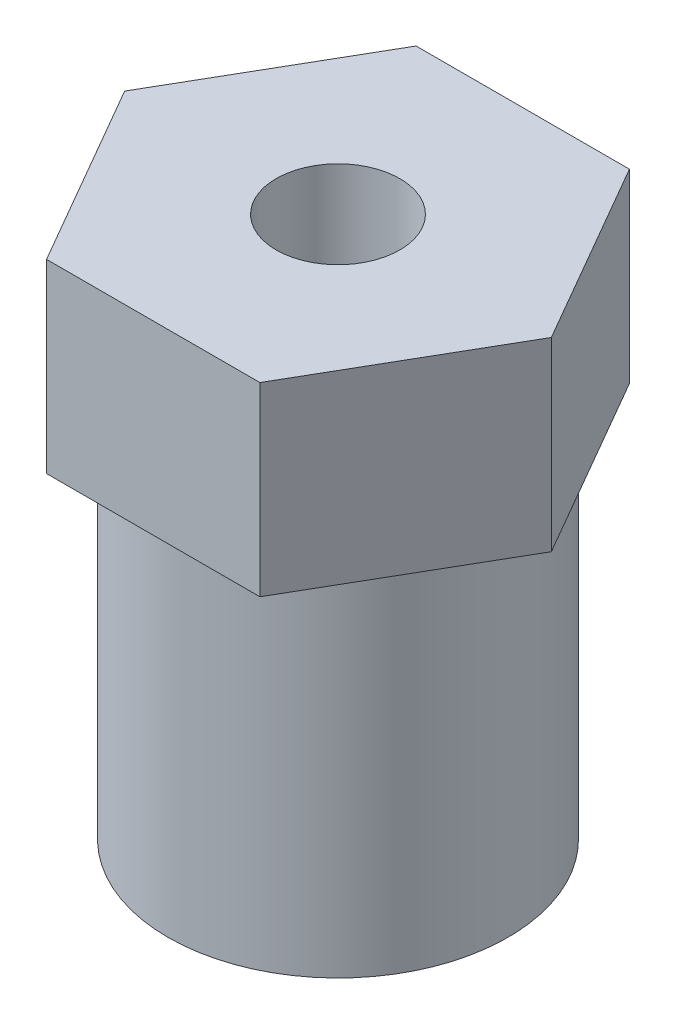
ISO-10303-21;
HEADER;
FILE_DESCRIPTION(('STEP AP214'),'2;1');
FILE_NAME('part.step','',(''),(''),'','','');
FILE_SCHEMA(('AUTOMOTIVE_DESIGN { 1 0 10303 214 1 1 1 1 }'));
ENDSEC;
DATA;
#1=APPLICATION_CONTEXT('core data for automotive mechanical design processes');
#2=APPLICATION_PROTOCOL_DEFINITION('international standard','automotive_design',2000,#1);
#3=PRODUCT_CONTEXT('',#1,'mechanical');
#4=PRODUCT('Part','Part','',(#3));
#5=PRODUCT_RELATED_PRODUCT_CATEGORY('part','',(#4));
#6=PRODUCT_DEFINITION_FORMATION('','',#4);
#7=PRODUCT_DEFINITION_CONTEXT('part definition',#1,'design');
#8=PRODUCT_DEFINITION('design','',#6,#7);
#9=PRODUCT_DEFINITION_SHAPE('','',#8);
#10=(LENGTH_UNIT() NAMED_UNIT(*) SI_UNIT(.MILLI.,.METRE.));
#11=(NAMED_UNIT(*) PLANE_ANGLE_UNIT() SI_UNIT($,.RADIAN.));
#12=(NAMED_UNIT(*) SI_UNIT($,.STERADIAN.) SOLID_ANGLE_UNIT());
#13=UNCERTAINTY_MEASURE_WITH_UNIT(LENGTH_MEASURE(1.E-05),#10,'distance_accuracy_value','');
#14=(GEOMETRIC_REPRESENTATION_CONTEXT(3) GLOBAL_UNCERTAINTY_ASSIGNED_CONTEXT((#13)) GLOBAL_UNIT_ASSIGNED_CONTEXT((#10,
#11,#12)) REPRESENTATION_CONTEXT('',''));
#15=CARTESIAN_POINT('',(0.,0.,0.));
#16=DIRECTION('',(0.,0.,1.));
#17=DIRECTION('',(1.,0.,0.));
#18=AXIS2_PLACEMENT_3D('',#15,#16,#17);
#19=CARTESIAN_POINT('',(0.,0.,0.));
#20=DIRECTION('',(0.,1.,0.));
#21=DIRECTION('',(0.,0.,1.));
#22=AXIS2_PLACEMENT_3D('',#19,#20,#21);
#23=PLANE('',#22);
#24=CARTESIAN_POINT('',(0.,0.,0.));
#25=DIRECTION('',(0.,1.,0.));
#26=DIRECTION('',(0.,0.,1.));
#27=AXIS2_PLACEMENT_3D('',#24,#25,#26);
#28=CIRCLE('',#27,2.);
#29=CARTESIAN_POINT('',(0.,0.,2.));
#30=VERTEX_POINT('',#29);
#31=EDGE_CURVE('E179',#30,#30,#28,.T.);
#32=ORIENTED_EDGE('',*,*,#31,.T.);
#33=EDGE_LOOP('',(#32));
#34=FACE_BOUND('',#33,.T.);
#35=CARTESIAN_POINT('',(0.,0.,0.));
#36=DIRECTION('',(0.,-1.,0.));
#37=DIRECTION('',(0.,0.,-1.));
#38=AXIS2_PLACEMENT_3D('',#35,#36,#37);
#39=CIRCLE('',#38,2.5);
#40=CARTESIAN_POINT('',(0.,0.,-2.5));
#41=VERTEX_POINT('',#40);
#42=EDGE_CURVE('E191',#41,#41,#39,.T.);
#43=ORIENTED_EDGE('',*,*,#42,.T.);
#44=EDGE_LOOP('',(#43));
#45=FACE_BOUND('',#44,.T.);
#46=ADVANCED_FACE('F43',(#34,#45),#23,.F.);
#47=CARTESIAN_POINT('',(0.,6.,0.));
#48=DIRECTION('',(0.,1.,0.));
#49=DIRECTION('',(0.,0.,1.));
#50=AXIS2_PLACEMENT_3D('',#47,#48,#49);
#51=PLANE('',#50);
#52=DIRECTION('',(0.499999999999995,0.,-0.866025403784441));
#53=VECTOR('',#52,1.);
#54=CARTESIAN_POINT('',(3.44966785840808,6.,5.97499999999996));
#55=LINE('',#54,#53);
#56=CARTESIAN_POINT('',(3.44966785840808,6.,5.97499999999996));
#57=VERTEX_POINT('',#56);
#58=CARTESIAN_POINT('',(6.89933571681603,6.,0.));
#59=VERTEX_POINT('',#58);
#60=EDGE_CURVE('E153',#57,#59,#55,.T.);
#61=ORIENTED_EDGE('',*,*,#60,.T.);
#62=DIRECTION('',(-0.500000000000001,0.,-0.866025403784438));
#63=VECTOR('',#62,1.);
#64=CARTESIAN_POINT('',(6.89933571681603,6.,0.));
#65=LINE('',#64,#63);
#66=CARTESIAN_POINT('',(3.449667858408,6.,-5.97500000000001));
#67=VERTEX_POINT('',#66);
#68=EDGE_CURVE('E100',#59,#67,#65,.T.);
#69=ORIENTED_EDGE('',*,*,#68,.T.);
#70=DIRECTION('',(-1.,0.,0.));
#71=VECTOR('',#70,1.);
#72=CARTESIAN_POINT('',(3.449667858408,6.,-5.97500000000001));
#73=LINE('',#72,#71);
#74=CARTESIAN_POINT('',(-3.44966785840804,6.,-5.97499999999999));
#75=VERTEX_POINT('',#74);
#76=EDGE_CURVE('E114',#67,#75,#73,.T.);
#77=ORIENTED_EDGE('',*,*,#76,.T.);
#78=DIRECTION('',(-0.499999999999995,0.,0.866025403784442));
#79=VECTOR('',#78,1.);
#80=CARTESIAN_POINT('',(-3.44966785840804,6.,-5.97499999999999));
#81=LINE('',#80,#79);
#82=CARTESIAN_POINT('',(-6.89933571681603,6.,0.));
#83=VERTEX_POINT('',#82);
#84=EDGE_CURVE('E107',#75,#83,#81,.T.);
#85=ORIENTED_EDGE('',*,*,#84,.T.);
#86=DIRECTION('',(0.500000000000007,0.,0.866025403784434));
#87=VECTOR('',#86,1.);
#88=CARTESIAN_POINT('',(-6.89933571681603,6.,0.));
#89=LINE('',#88,#87);
#90=CARTESIAN_POINT('',(-3.44966785840796,6.,5.97500000000004));
#91=VERTEX_POINT('',#90);
#92=EDGE_CURVE('E112',#83,#91,#89,.T.);
#93=ORIENTED_EDGE('',*,*,#92,.T.);
#94=DIRECTION('',(1.,0.,0.));
#95=VECTOR('',#94,1.);
#96=CARTESIAN_POINT('',(-3.44966785840796,6.,5.97500000000004));
#97=LINE('',#96,#95);
#98=EDGE_CURVE('E62',#91,#57,#97,.T.);
#99=ORIENTED_EDGE('',*,*,#98,.T.);
#100=EDGE_LOOP('',(#61,#69,#77,#85,#93,#99));
#101=FACE_BOUND('',#100,.T.);
#102=CARTESIAN_POINT('',(0.,6.,0.));
#103=DIRECTION('',(0.,1.,0.));
#104=DIRECTION('',(0.,0.,1.));
#105=AXIS2_PLACEMENT_3D('',#102,#103,#104);
#106=CIRCLE('',#105,2.);
#107=CARTESIAN_POINT('',(0.,6.,2.));
#108=VERTEX_POINT('',#107);
#109=EDGE_CURVE('E141',#108,#108,#106,.T.);
#110=ORIENTED_EDGE('',*,*,#109,.F.);
#111=EDGE_LOOP('',(#110));
#112=FACE_BOUND('',#111,.T.);
#113=ADVANCED_FACE('F109',(#101,#112),#51,.T.);
#114=CARTESIAN_POINT('',(0.,0.,0.));
#115=DIRECTION('',(0.,-1.,0.));
#116=DIRECTION('',(0.,0.,-1.));
#117=AXIS2_PLACEMENT_3D('',#114,#115,#116);
#118=CIRCLE('',#117,5.5);
#119=CARTESIAN_POINT('',(0.,0.,-5.5));
#120=VERTEX_POINT('',#119);
#121=EDGE_CURVE('E11',#120,#120,#118,.T.);
#122=ORIENTED_EDGE('',*,*,#121,.F.);
#123=EDGE_LOOP('',(#122));
#124=FACE_BOUND('',#123,.T.);
#125=DIRECTION('',(0.499999999999995,0.,-0.866025403784441));
#126=VECTOR('',#125,1.);
#127=CARTESIAN_POINT('',(3.44966785840808,0.,5.97499999999996));
#128=LINE('',#127,#126);
#129=CARTESIAN_POINT('',(3.44966785840808,0.,5.97499999999996));
#130=VERTEX_POINT('',#129);
#131=CARTESIAN_POINT('',(6.89933571681603,0.,0.));
#132=VERTEX_POINT('',#131);
#133=EDGE_CURVE('E136',#130,#132,#128,.T.);
#134=ORIENTED_EDGE('',*,*,#133,.F.);
#135=DIRECTION('',(1.,0.,0.));
#136=VECTOR('',#135,1.);
#137=CARTESIAN_POINT('',(-3.44966785840796,0.,5.97500000000004));
#138=LINE('',#137,#136);
#139=CARTESIAN_POINT('',(-3.44966785840796,0.,5.97500000000004));
#140=VERTEX_POINT('',#139);
#141=EDGE_CURVE('E91',#140,#130,#138,.T.);
#142=ORIENTED_EDGE('',*,*,#141,.F.);
#143=DIRECTION('',(0.500000000000007,0.,0.866025403784434));
#144=VECTOR('',#143,1.);
#145=CARTESIAN_POINT('',(-6.89933571681603,0.,0.));
#146=LINE('',#145,#144);
#147=CARTESIAN_POINT('',(-6.89933571681603,0.,0.));
#148=VERTEX_POINT('',#147);
#149=EDGE_CURVE('E85',#148,#140,#146,.T.);
#150=ORIENTED_EDGE('',*,*,#149,.F.);
#151=DIRECTION('',(-0.499999999999995,0.,0.866025403784442));
#152=VECTOR('',#151,1.);
#153=CARTESIAN_POINT('',(-3.44966785840804,0.,-5.97499999999999));
#154=LINE('',#153,#152);
#155=CARTESIAN_POINT('',(-3.44966785840804,0.,-5.97499999999999));
#156=VERTEX_POINT('',#155);
#157=EDGE_CURVE('E123',#156,#148,#154,.T.);
#158=ORIENTED_EDGE('',*,*,#157,.F.);
#159=DIRECTION('',(-1.,0.,0.));
#160=VECTOR('',#159,1.);
#161=CARTESIAN_POINT('',(3.449667858408,0.,-5.97500000000001));
#162=LINE('',#161,#160);
#163=CARTESIAN_POINT('',(3.449667858408,0.,-5.97500000000001));
#164=VERTEX_POINT('',#163);
#165=EDGE_CURVE('E144',#164,#156,#162,.T.);
#166=ORIENTED_EDGE('',*,*,#165,.F.);
#167=DIRECTION('',(-0.500000000000001,0.,-0.866025403784438));
#168=VECTOR('',#167,1.);
#169=CARTESIAN_POINT('',(6.89933571681603,0.,0.));
#170=LINE('',#169,#168);
#171=EDGE_CURVE('E140',#132,#164,#170,.T.);
#172=ORIENTED_EDGE('',*,*,#171,.F.);
#173=EDGE_LOOP('',(#134,#142,#150,#158,#166,#172));
#174=FACE_BOUND('',#173,.T.);
#175=ADVANCED_FACE('F171',(#124,#174),#23,.F.);
#176=CARTESIAN_POINT('',(3.44966785840808,6.,5.97499999999996));
#177=DIRECTION('',(-0.866025403784441,0.,-0.499999999999995));
#178=DIRECTION('',(-0.499999999999995,0.,0.866025403784441));
#179=AXIS2_PLACEMENT_3D('',#176,#177,#178);
#180=PLANE('',#179);
#181=ORIENTED_EDGE('',*,*,#133,.T.);
#182=DIRECTION('',(0.,-1.,0.));
#183=VECTOR('',#182,1.);
#184=CARTESIAN_POINT('',(6.89933571681603,6.,0.));
#185=LINE('',#184,#183);
#186=EDGE_CURVE('E47',#59,#132,#185,.T.);
#187=ORIENTED_EDGE('',*,*,#186,.F.);
#188=ORIENTED_EDGE('',*,*,#60,.F.);
#189=DIRECTION('',(0.,-1.,0.));
#190=VECTOR('',#189,1.);
#191=CARTESIAN_POINT('',(3.44966785840808,6.,5.97499999999996));
#192=LINE('',#191,#190);
#193=EDGE_CURVE('E132',#57,#130,#192,.T.);
#194=ORIENTED_EDGE('',*,*,#193,.T.);
#195=EDGE_LOOP('',(#181,#187,#188,#194));
#196=FACE_BOUND('',#195,.T.);
#197=ADVANCED_FACE('F45',(#196),#180,.F.);
#198=CARTESIAN_POINT('',(6.89933571681603,6.,0.));
#199=DIRECTION('',(-0.866025403784438,0.,0.500000000000001));
#200=DIRECTION('',(0.500000000000001,0.,0.866025403784438));
#201=AXIS2_PLACEMENT_3D('',#198,#199,#200);
#202=PLANE('',#201);
#203=ORIENTED_EDGE('',*,*,#171,.T.);
#204=DIRECTION('',(0.,-1.,0.));
#205=VECTOR('',#204,1.);
#206=CARTESIAN_POINT('',(3.449667858408,6.,-5.97500000000001));
#207=LINE('',#206,#205);
#208=EDGE_CURVE('E159',#67,#164,#207,.T.);
#209=ORIENTED_EDGE('',*,*,#208,.F.);
#210=ORIENTED_EDGE('',*,*,#68,.F.);
#211=ORIENTED_EDGE('',*,*,#186,.T.);
#212=EDGE_LOOP('',(#203,#209,#210,#211));
#213=FACE_BOUND('',#212,.T.);
#214=ADVANCED_FACE('F166',(#213),#202,.F.);
#215=CARTESIAN_POINT('',(3.449667858408,6.,-5.97500000000001));
#216=DIRECTION('',(0.,0.,1.));
#217=DIRECTION('',(1.,0.,0.));
#218=AXIS2_PLACEMENT_3D('',#215,#216,#217);
#219=PLANE('',#218);
#220=ORIENTED_EDGE('',*,*,#165,.T.);
#221=DIRECTION('',(0.,-1.,0.));
#222=VECTOR('',#221,1.);
#223=CARTESIAN_POINT('',(-3.44966785840804,6.,-5.97499999999999));
#224=LINE('',#223,#222);
#225=EDGE_CURVE('E125',#75,#156,#224,.T.);
#226=ORIENTED_EDGE('',*,*,#225,.F.);
#227=ORIENTED_EDGE('',*,*,#76,.F.);
#228=ORIENTED_EDGE('',*,*,#208,.T.);
#229=EDGE_LOOP('',(#220,#226,#227,#228));
#230=FACE_BOUND('',#229,.T.);
#231=ADVANCED_FACE('F172',(#230),#219,.F.);
#232=CARTESIAN_POINT('',(-3.44966785840804,6.,-5.97499999999999));
#233=DIRECTION('',(0.866025403784441,0.,0.499999999999995));
#234=DIRECTION('',(0.499999999999995,0.,-0.866025403784442));
#235=AXIS2_PLACEMENT_3D('',#232,#233,#234);
#236=PLANE('',#235);
#237=ORIENTED_EDGE('',*,*,#157,.T.);
#238=DIRECTION('',(0.,-1.,0.));
#239=VECTOR('',#238,1.);
#240=CARTESIAN_POINT('',(-6.89933571681603,6.,0.));
#241=LINE('',#240,#239);
#242=EDGE_CURVE('E120',#83,#148,#241,.T.);
#243=ORIENTED_EDGE('',*,*,#242,.F.);
#244=ORIENTED_EDGE('',*,*,#84,.F.);
#245=ORIENTED_EDGE('',*,*,#225,.T.);
#246=EDGE_LOOP('',(#237,#243,#244,#245));
#247=FACE_BOUND('',#246,.T.);
#248=ADVANCED_FACE('F121',(#247),#236,.F.);
#249=CARTESIAN_POINT('',(-6.89933571681603,6.,0.));
#250=DIRECTION('',(0.866025403784435,0.,-0.500000000000007));
#251=DIRECTION('',(-0.500000000000007,0.,-0.866025403784434));
#252=AXIS2_PLACEMENT_3D('',#249,#250,#251);
#253=PLANE('',#252);
#254=ORIENTED_EDGE('',*,*,#149,.T.);
#255=DIRECTION('',(0.,-1.,0.));
#256=VECTOR('',#255,1.);
#257=CARTESIAN_POINT('',(-3.44966785840796,6.,5.97500000000004));
#258=LINE('',#257,#256);
#259=EDGE_CURVE('E126',#91,#140,#258,.T.);
#260=ORIENTED_EDGE('',*,*,#259,.F.);
#261=ORIENTED_EDGE('',*,*,#92,.F.);
#262=ORIENTED_EDGE('',*,*,#242,.T.);
#263=EDGE_LOOP('',(#254,#260,#261,#262));
#264=FACE_BOUND('',#263,.T.);
#265=ADVANCED_FACE('F128',(#264),#253,.F.);
#266=CARTESIAN_POINT('',(-3.44966785840796,6.,5.97500000000004));
#267=DIRECTION('',(0.,0.,-1.));
#268=DIRECTION('',(-1.,0.,0.));
#269=AXIS2_PLACEMENT_3D('',#266,#267,#268);
#270=PLANE('',#269);
#271=ORIENTED_EDGE('',*,*,#141,.T.);
#272=ORIENTED_EDGE('',*,*,#193,.F.);
#273=ORIENTED_EDGE('',*,*,#98,.F.);
#274=ORIENTED_EDGE('',*,*,#259,.T.);
#275=EDGE_LOOP('',(#271,#272,#273,#274));
#276=FACE_BOUND('',#275,.T.);
#277=ADVANCED_FACE('F214',(#276),#270,.F.);
#278=CARTESIAN_POINT('',(0.,6.,0.));
#279=DIRECTION('',(0.,-1.,0.));
#280=DIRECTION('',(0.,0.,-1.));
#281=AXIS2_PLACEMENT_3D('',#278,#279,#280);
#282=CYLINDRICAL_SURFACE('',#281,2.);
#283=ORIENTED_EDGE('',*,*,#109,.T.);
#284=EDGE_LOOP('',(#283));
#285=FACE_BOUND('',#284,.T.);
#286=ORIENTED_EDGE('',*,*,#31,.F.);
#287=EDGE_LOOP('',(#286));
#288=FACE_BOUND('',#287,.T.);
#289=ADVANCED_FACE('F205',(#285,#288),#282,.F.);
#290=CARTESIAN_POINT('',(0.,-11.5,0.));
#291=DIRECTION('',(0.,-1.,0.));
#292=DIRECTION('',(0.,0.,-1.));
#293=AXIS2_PLACEMENT_3D('',#290,#291,#292);
#294=PLANE('',#293);
#295=CARTESIAN_POINT('',(0.,-11.5,0.));
#296=DIRECTION('',(0.,-1.,0.));
#297=DIRECTION('',(0.,0.,-1.));
#298=AXIS2_PLACEMENT_3D('',#295,#296,#297);
#299=CIRCLE('',#298,5.5);
#300=CARTESIAN_POINT('',(0.,-11.5,-5.5));
#301=VERTEX_POINT('',#300);
#302=EDGE_CURVE('E183',#301,#301,#299,.T.);
#303=ORIENTED_EDGE('',*,*,#302,.T.);
#304=EDGE_LOOP('',(#303));
#305=FACE_BOUND('',#304,.T.);
#306=CARTESIAN_POINT('',(0.,-11.5,0.));
#307=DIRECTION('',(0.,-1.,0.));
#308=DIRECTION('',(0.,0.,-1.));
#309=AXIS2_PLACEMENT_3D('',#306,#307,#308);
#310=CIRCLE('',#309,2.5);
#311=CARTESIAN_POINT('',(0.,-11.5,-2.5));
#312=VERTEX_POINT('',#311);
#313=EDGE_CURVE('E190',#312,#312,#310,.T.);
#314=ORIENTED_EDGE('',*,*,#313,.F.);
#315=EDGE_LOOP('',(#314));
#316=FACE_BOUND('',#315,.T.);
#317=ADVANCED_FACE('F202',(#305,#316),#294,.T.);
#318=CARTESIAN_POINT('',(0.,-11.5,0.));
#319=DIRECTION('',(0.,1.,0.));
#320=DIRECTION('',(0.,0.,1.));
#321=AXIS2_PLACEMENT_3D('',#318,#319,#320);
#322=CYLINDRICAL_SURFACE('',#321,5.5);
#323=ORIENTED_EDGE('',*,*,#302,.F.);
#324=EDGE_LOOP('',(#323));
#325=FACE_BOUND('',#324,.T.);
#326=ORIENTED_EDGE('',*,*,#121,.T.);
#327=EDGE_LOOP('',(#326));
#328=FACE_BOUND('',#327,.T.);
#329=ADVANCED_FACE('F204',(#325,#328),#322,.T.);
#330=CARTESIAN_POINT('',(0.,-11.5,0.));
#331=DIRECTION('',(0.,1.,0.));
#332=DIRECTION('',(0.,0.,1.));
#333=AXIS2_PLACEMENT_3D('',#330,#331,#332);
#334=CYLINDRICAL_SURFACE('',#333,2.5);
#335=ORIENTED_EDGE('',*,*,#313,.T.);
#336=EDGE_LOOP('',(#335));
#337=FACE_BOUND('',#336,.T.);
#338=ORIENTED_EDGE('',*,*,#42,.F.);
#339=EDGE_LOOP('',(#338));
#340=FACE_BOUND('',#339,.T.);
#341=ADVANCED_FACE('F199',(#337,#340),#334,.F.);
#342=CLOSED_SHELL('',(#46,#113,#175,#197,#214,#231,#248,#265,#277,#289,#317,#329,#341));
#343=MANIFOLD_SOLID_BREP('B2',#342);
#344=ADVANCED_BREP_SHAPE_REPRESENTATION('',(#18,#343),#14);
#345=SHAPE_DEFINITION_REPRESENTATION(#9,#344);
ENDSEC;
END-ISO-10303-21;
